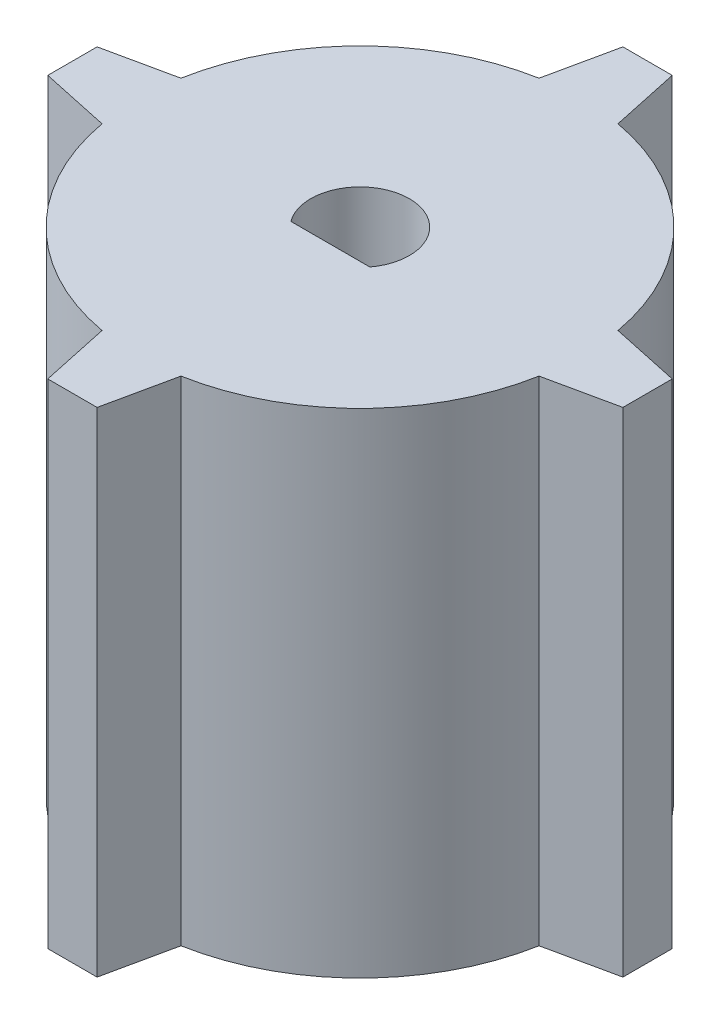
ISO-10303-21;
HEADER;
FILE_DESCRIPTION(('STEP AP214'),'2;1');
FILE_NAME('part.step','',(''),(''),'','','');
FILE_SCHEMA(('AUTOMOTIVE_DESIGN { 1 0 10303 214 1 1 1 1 }'));
ENDSEC;
DATA;
#1=APPLICATION_CONTEXT('core data for automotive mechanical design processes');
#2=APPLICATION_PROTOCOL_DEFINITION('international standard','automotive_design',2000,#1);
#3=PRODUCT_CONTEXT('',#1,'mechanical');
#4=PRODUCT('Part','Part','',(#3));
#5=PRODUCT_RELATED_PRODUCT_CATEGORY('part','',(#4));
#6=PRODUCT_DEFINITION_FORMATION('','',#4);
#7=PRODUCT_DEFINITION_CONTEXT('part definition',#1,'design');
#8=PRODUCT_DEFINITION('design','',#6,#7);
#9=PRODUCT_DEFINITION_SHAPE('','',#8);
#10=(LENGTH_UNIT() NAMED_UNIT(*) SI_UNIT(.MILLI.,.METRE.));
#11=(NAMED_UNIT(*) PLANE_ANGLE_UNIT() SI_UNIT($,.RADIAN.));
#12=(NAMED_UNIT(*) SI_UNIT($,.STERADIAN.) SOLID_ANGLE_UNIT());
#13=UNCERTAINTY_MEASURE_WITH_UNIT(LENGTH_MEASURE(1.E-05),#10,'distance_accuracy_value','');
#14=(GEOMETRIC_REPRESENTATION_CONTEXT(3) GLOBAL_UNCERTAINTY_ASSIGNED_CONTEXT((#13)) GLOBAL_UNIT_ASSIGNED_CONTEXT((#10,
#11,#12)) REPRESENTATION_CONTEXT('',''));
#15=CARTESIAN_POINT('',(0.,0.,0.));
#16=DIRECTION('',(0.,0.,1.));
#17=DIRECTION('',(1.,0.,0.));
#18=AXIS2_PLACEMENT_3D('',#15,#16,#17);
#19=CARTESIAN_POINT('',(0.,25.4,0.));
#20=DIRECTION('',(0.,1.,0.));
#21=DIRECTION('',(0.,0.,1.));
#22=AXIS2_PLACEMENT_3D('',#19,#20,#21);
#23=PLANE('',#22);
#24=CARTESIAN_POINT('',(0.,25.4,0.));
#25=DIRECTION('',(0.,1.,0.));
#26=DIRECTION('',(0.,0.,1.));
#27=AXIS2_PLACEMENT_3D('',#24,#25,#26);
#28=CIRCLE('',#27,11.43);
#29=CARTESIAN_POINT('',(-2.032,25.4,-11.2479276313461));
#30=VERTEX_POINT('',#29);
#31=CARTESIAN_POINT('',(-11.2479276313461,25.4,-2.032));
#32=VERTEX_POINT('',#31);
#33=EDGE_CURVE('E193',#30,#32,#28,.T.);
#34=ORIENTED_EDGE('',*,*,#33,.T.);
#35=DIRECTION('',(-0.977802414077409,0.,0.209529088730874));
#36=VECTOR('',#35,1.);
#37=CARTESIAN_POINT('',(-14.8039276313461,25.4,-1.27));
#38=LINE('',#37,#36);
#39=CARTESIAN_POINT('',(-14.8039276313461,25.4,-1.27));
#40=VERTEX_POINT('',#39);
#41=EDGE_CURVE('E197',#32,#40,#38,.T.);
#42=ORIENTED_EDGE('',*,*,#41,.T.);
#43=DIRECTION('',(0.,0.,1.));
#44=VECTOR('',#43,1.);
#45=CARTESIAN_POINT('',(-14.8039276313461,25.4,1.27));
#46=LINE('',#45,#44);
#47=CARTESIAN_POINT('',(-14.8039276313461,25.4,1.27));
#48=VERTEX_POINT('',#47);
#49=EDGE_CURVE('E201',#40,#48,#46,.T.);
#50=ORIENTED_EDGE('',*,*,#49,.T.);
#51=DIRECTION('',(0.977802414077409,0.,0.209529088730873));
#52=VECTOR('',#51,1.);
#53=CARTESIAN_POINT('',(-11.2479276313461,25.4,2.032));
#54=LINE('',#53,#52);
#55=CARTESIAN_POINT('',(-11.2479276313461,25.4,2.032));
#56=VERTEX_POINT('',#55);
#57=EDGE_CURVE('E204',#48,#56,#54,.T.);
#58=ORIENTED_EDGE('',*,*,#57,.T.);
#59=CARTESIAN_POINT('',(0.,25.4,0.));
#60=DIRECTION('',(0.,1.,0.));
#61=DIRECTION('',(0.,0.,1.));
#62=AXIS2_PLACEMENT_3D('',#59,#60,#61);
#63=CIRCLE('',#62,11.43);
#64=CARTESIAN_POINT('',(-2.032,25.4,11.2479276313461));
#65=VERTEX_POINT('',#64);
#66=EDGE_CURVE('E207',#56,#65,#63,.T.);
#67=ORIENTED_EDGE('',*,*,#66,.T.);
#68=DIRECTION('',(0.209529088730874,0.,0.977802414077409));
#69=VECTOR('',#68,1.);
#70=CARTESIAN_POINT('',(-1.27,25.4,14.8039276313461));
#71=LINE('',#70,#69);
#72=CARTESIAN_POINT('',(-1.27,25.4,14.8039276313461));
#73=VERTEX_POINT('',#72);
#74=EDGE_CURVE('E210',#65,#73,#71,.T.);
#75=ORIENTED_EDGE('',*,*,#74,.T.);
#76=DIRECTION('',(1.,0.,0.));
#77=VECTOR('',#76,1.);
#78=CARTESIAN_POINT('',(1.27,25.4,14.8039276313461));
#79=LINE('',#78,#77);
#80=CARTESIAN_POINT('',(1.27,25.4,14.8039276313461));
#81=VERTEX_POINT('',#80);
#82=EDGE_CURVE('E213',#73,#81,#79,.T.);
#83=ORIENTED_EDGE('',*,*,#82,.T.);
#84=DIRECTION('',(0.209529088730874,0.,-0.977802414077409));
#85=VECTOR('',#84,1.);
#86=CARTESIAN_POINT('',(2.032,25.4,11.2479276313461));
#87=LINE('',#86,#85);
#88=CARTESIAN_POINT('',(2.032,25.4,11.2479276313461));
#89=VERTEX_POINT('',#88);
#90=EDGE_CURVE('E216',#81,#89,#87,.T.);
#91=ORIENTED_EDGE('',*,*,#90,.T.);
#92=CARTESIAN_POINT('',(0.,25.4,0.));
#93=DIRECTION('',(0.,1.,0.));
#94=DIRECTION('',(0.,0.,1.));
#95=AXIS2_PLACEMENT_3D('',#92,#93,#94);
#96=CIRCLE('',#95,11.43);
#97=CARTESIAN_POINT('',(11.2479276313461,25.4,2.032));
#98=VERTEX_POINT('',#97);
#99=EDGE_CURVE('E219',#89,#98,#96,.T.);
#100=ORIENTED_EDGE('',*,*,#99,.T.);
#101=DIRECTION('',(0.977802414077409,0.,-0.209529088730874));
#102=VECTOR('',#101,1.);
#103=CARTESIAN_POINT('',(14.8039276313461,25.4,1.27));
#104=LINE('',#103,#102);
#105=CARTESIAN_POINT('',(14.8039276313461,25.4,1.27));
#106=VERTEX_POINT('',#105);
#107=EDGE_CURVE('E222',#98,#106,#104,.T.);
#108=ORIENTED_EDGE('',*,*,#107,.T.);
#109=DIRECTION('',(0.,0.,-1.));
#110=VECTOR('',#109,1.);
#111=CARTESIAN_POINT('',(14.8039276313461,25.4,-1.27));
#112=LINE('',#111,#110);
#113=CARTESIAN_POINT('',(14.8039276313461,25.4,-1.27));
#114=VERTEX_POINT('',#113);
#115=EDGE_CURVE('E225',#106,#114,#112,.T.);
#116=ORIENTED_EDGE('',*,*,#115,.T.);
#117=DIRECTION('',(-0.977802414077409,0.,-0.209529088730874));
#118=VECTOR('',#117,1.);
#119=CARTESIAN_POINT('',(11.2479276313461,25.4,-2.032));
#120=LINE('',#119,#118);
#121=CARTESIAN_POINT('',(11.2479276313461,25.4,-2.032));
#122=VERTEX_POINT('',#121);
#123=EDGE_CURVE('E228',#114,#122,#120,.T.);
#124=ORIENTED_EDGE('',*,*,#123,.T.);
#125=CARTESIAN_POINT('',(0.,25.4,0.));
#126=DIRECTION('',(0.,1.,0.));
#127=DIRECTION('',(0.,0.,1.));
#128=AXIS2_PLACEMENT_3D('',#125,#126,#127);
#129=CIRCLE('',#128,11.43);
#130=CARTESIAN_POINT('',(2.032,25.4,-11.2479276313461));
#131=VERTEX_POINT('',#130);
#132=EDGE_CURVE('E231',#122,#131,#129,.T.);
#133=ORIENTED_EDGE('',*,*,#132,.T.);
#134=DIRECTION('',(-0.209529088730873,0.,-0.977802414077409));
#135=VECTOR('',#134,1.);
#136=CARTESIAN_POINT('',(1.27,25.4,-14.8039276313461));
#137=LINE('',#136,#135);
#138=CARTESIAN_POINT('',(1.27,25.4,-14.8039276313461));
#139=VERTEX_POINT('',#138);
#140=EDGE_CURVE('E234',#131,#139,#137,.T.);
#141=ORIENTED_EDGE('',*,*,#140,.T.);
#142=DIRECTION('',(-1.,0.,0.));
#143=VECTOR('',#142,1.);
#144=CARTESIAN_POINT('',(-1.27,25.4,-14.8039276313461));
#145=LINE('',#144,#143);
#146=CARTESIAN_POINT('',(-1.27,25.4,-14.8039276313461));
#147=VERTEX_POINT('',#146);
#148=EDGE_CURVE('E237',#139,#147,#145,.T.);
#149=ORIENTED_EDGE('',*,*,#148,.T.);
#150=DIRECTION('',(-0.209529088730874,0.,0.977802414077409));
#151=VECTOR('',#150,1.);
#152=CARTESIAN_POINT('',(-2.032,25.4,-11.2479276313461));
#153=LINE('',#152,#151);
#154=EDGE_CURVE('E240',#147,#30,#153,.T.);
#155=ORIENTED_EDGE('',*,*,#154,.T.);
#156=EDGE_LOOP('',(#34,#42,#50,#58,#67,#75,#83,#91,#100,#108,#116,#124,#133,#141,#149,#155));
#157=FACE_BOUND('',#156,.T.);
#158=DIRECTION('',(1.,0.,0.));
#159=VECTOR('',#158,1.);
#160=CARTESIAN_POINT('',(-2.032,25.4,1.524));
#161=LINE('',#160,#159);
#162=CARTESIAN_POINT('',(-2.032,25.4,1.524));
#163=VERTEX_POINT('',#162);
#164=CARTESIAN_POINT('',(2.032,25.4,1.524));
#165=VERTEX_POINT('',#164);
#166=EDGE_CURVE('E170',#163,#165,#161,.T.);
#167=ORIENTED_EDGE('',*,*,#166,.F.);
#168=CARTESIAN_POINT('',(0.,25.4,0.));
#169=DIRECTION('',(0.,1.,0.));
#170=DIRECTION('',(0.,0.,-1.));
#171=AXIS2_PLACEMENT_3D('',#168,#169,#170);
#172=CIRCLE('',#171,2.54);
#173=EDGE_CURVE('E177',#165,#163,#172,.T.);
#174=ORIENTED_EDGE('',*,*,#173,.F.);
#175=EDGE_LOOP('',(#167,#174));
#176=FACE_BOUND('',#175,.T.);
#177=ADVANCED_FACE('F45',(#157,#176),#23,.T.);
#178=CARTESIAN_POINT('',(0.,0.,0.));
#179=DIRECTION('',(0.,1.,0.));
#180=DIRECTION('',(0.,0.,1.));
#181=AXIS2_PLACEMENT_3D('',#178,#179,#180);
#182=PLANE('',#181);
#183=CARTESIAN_POINT('',(0.,0.,0.));
#184=DIRECTION('',(0.,1.,0.));
#185=DIRECTION('',(0.,0.,1.));
#186=AXIS2_PLACEMENT_3D('',#183,#184,#185);
#187=CIRCLE('',#186,11.43);
#188=CARTESIAN_POINT('',(-2.032,0.,-11.2479276313461));
#189=VERTEX_POINT('',#188);
#190=CARTESIAN_POINT('',(-11.2479276313461,0.,-2.032));
#191=VERTEX_POINT('',#190);
#192=EDGE_CURVE('E192',#189,#191,#187,.T.);
#193=ORIENTED_EDGE('',*,*,#192,.F.);
#194=DIRECTION('',(-0.209529088730874,0.,0.977802414077409));
#195=VECTOR('',#194,1.);
#196=CARTESIAN_POINT('',(-2.032,0.,-11.2479276313461));
#197=LINE('',#196,#195);
#198=CARTESIAN_POINT('',(-1.27,0.,-14.8039276313461));
#199=VERTEX_POINT('',#198);
#200=EDGE_CURVE('E198',#199,#189,#197,.T.);
#201=ORIENTED_EDGE('',*,*,#200,.F.);
#202=DIRECTION('',(-1.,0.,0.));
#203=VECTOR('',#202,1.);
#204=CARTESIAN_POINT('',(-1.27,0.,-14.8039276313461));
#205=LINE('',#204,#203);
#206=CARTESIAN_POINT('',(1.27,0.,-14.8039276313461));
#207=VERTEX_POINT('',#206);
#208=EDGE_CURVE('E286',#207,#199,#205,.T.);
#209=ORIENTED_EDGE('',*,*,#208,.F.);
#210=DIRECTION('',(-0.209529088730873,0.,-0.977802414077409));
#211=VECTOR('',#210,1.);
#212=CARTESIAN_POINT('',(1.27,0.,-14.8039276313461));
#213=LINE('',#212,#211);
#214=CARTESIAN_POINT('',(2.032,0.,-11.2479276313461));
#215=VERTEX_POINT('',#214);
#216=EDGE_CURVE('E283',#215,#207,#213,.T.);
#217=ORIENTED_EDGE('',*,*,#216,.F.);
#218=CARTESIAN_POINT('',(0.,0.,0.));
#219=DIRECTION('',(0.,1.,0.));
#220=DIRECTION('',(0.,0.,1.));
#221=AXIS2_PLACEMENT_3D('',#218,#219,#220);
#222=CIRCLE('',#221,11.43);
#223=CARTESIAN_POINT('',(11.2479276313461,0.,-2.032));
#224=VERTEX_POINT('',#223);
#225=EDGE_CURVE('E280',#224,#215,#222,.T.);
#226=ORIENTED_EDGE('',*,*,#225,.F.);
#227=DIRECTION('',(-0.977802414077409,0.,-0.209529088730874));
#228=VECTOR('',#227,1.);
#229=CARTESIAN_POINT('',(11.2479276313461,0.,-2.032));
#230=LINE('',#229,#228);
#231=CARTESIAN_POINT('',(14.8039276313461,0.,-1.27));
#232=VERTEX_POINT('',#231);
#233=EDGE_CURVE('E277',#232,#224,#230,.T.);
#234=ORIENTED_EDGE('',*,*,#233,.F.);
#235=DIRECTION('',(0.,0.,-1.));
#236=VECTOR('',#235,1.);
#237=CARTESIAN_POINT('',(14.8039276313461,0.,-1.27));
#238=LINE('',#237,#236);
#239=CARTESIAN_POINT('',(14.8039276313461,0.,1.27));
#240=VERTEX_POINT('',#239);
#241=EDGE_CURVE('E274',#240,#232,#238,.T.);
#242=ORIENTED_EDGE('',*,*,#241,.F.);
#243=DIRECTION('',(0.977802414077409,0.,-0.209529088730874));
#244=VECTOR('',#243,1.);
#245=CARTESIAN_POINT('',(14.8039276313461,0.,1.27));
#246=LINE('',#245,#244);
#247=CARTESIAN_POINT('',(11.2479276313461,0.,2.032));
#248=VERTEX_POINT('',#247);
#249=EDGE_CURVE('E271',#248,#240,#246,.T.);
#250=ORIENTED_EDGE('',*,*,#249,.F.);
#251=CARTESIAN_POINT('',(0.,0.,0.));
#252=DIRECTION('',(0.,1.,0.));
#253=DIRECTION('',(0.,0.,1.));
#254=AXIS2_PLACEMENT_3D('',#251,#252,#253);
#255=CIRCLE('',#254,11.43);
#256=CARTESIAN_POINT('',(2.032,0.,11.2479276313461));
#257=VERTEX_POINT('',#256);
#258=EDGE_CURVE('E268',#257,#248,#255,.T.);
#259=ORIENTED_EDGE('',*,*,#258,.F.);
#260=DIRECTION('',(0.209529088730874,0.,-0.977802414077409));
#261=VECTOR('',#260,1.);
#262=CARTESIAN_POINT('',(2.032,0.,11.2479276313461));
#263=LINE('',#262,#261);
#264=CARTESIAN_POINT('',(1.27,0.,14.8039276313461));
#265=VERTEX_POINT('',#264);
#266=EDGE_CURVE('E265',#265,#257,#263,.T.);
#267=ORIENTED_EDGE('',*,*,#266,.F.);
#268=DIRECTION('',(1.,0.,0.));
#269=VECTOR('',#268,1.);
#270=CARTESIAN_POINT('',(1.27,0.,14.8039276313461));
#271=LINE('',#270,#269);
#272=CARTESIAN_POINT('',(-1.27,0.,14.8039276313461));
#273=VERTEX_POINT('',#272);
#274=EDGE_CURVE('E262',#273,#265,#271,.T.);
#275=ORIENTED_EDGE('',*,*,#274,.F.);
#276=DIRECTION('',(0.209529088730874,0.,0.977802414077409));
#277=VECTOR('',#276,1.);
#278=CARTESIAN_POINT('',(-1.27,0.,14.8039276313461));
#279=LINE('',#278,#277);
#280=CARTESIAN_POINT('',(-2.032,0.,11.2479276313461));
#281=VERTEX_POINT('',#280);
#282=EDGE_CURVE('E259',#281,#273,#279,.T.);
#283=ORIENTED_EDGE('',*,*,#282,.F.);
#284=CARTESIAN_POINT('',(0.,0.,0.));
#285=DIRECTION('',(0.,1.,0.));
#286=DIRECTION('',(0.,0.,1.));
#287=AXIS2_PLACEMENT_3D('',#284,#285,#286);
#288=CIRCLE('',#287,11.43);
#289=CARTESIAN_POINT('',(-11.2479276313461,0.,2.032));
#290=VERTEX_POINT('',#289);
#291=EDGE_CURVE('E256',#290,#281,#288,.T.);
#292=ORIENTED_EDGE('',*,*,#291,.F.);
#293=DIRECTION('',(0.977802414077409,0.,0.209529088730873));
#294=VECTOR('',#293,1.);
#295=CARTESIAN_POINT('',(-11.2479276313461,0.,2.032));
#296=LINE('',#295,#294);
#297=CARTESIAN_POINT('',(-14.8039276313461,0.,1.27));
#298=VERTEX_POINT('',#297);
#299=EDGE_CURVE('E253',#298,#290,#296,.T.);
#300=ORIENTED_EDGE('',*,*,#299,.F.);
#301=DIRECTION('',(0.,0.,1.));
#302=VECTOR('',#301,1.);
#303=CARTESIAN_POINT('',(-14.8039276313461,0.,1.27));
#304=LINE('',#303,#302);
#305=CARTESIAN_POINT('',(-14.8039276313461,0.,-1.27));
#306=VERTEX_POINT('',#305);
#307=EDGE_CURVE('E250',#306,#298,#304,.T.);
#308=ORIENTED_EDGE('',*,*,#307,.F.);
#309=DIRECTION('',(-0.977802414077409,0.,0.209529088730874));
#310=VECTOR('',#309,1.);
#311=CARTESIAN_POINT('',(-14.8039276313461,0.,-1.27));
#312=LINE('',#311,#310);
#313=EDGE_CURVE('E247',#191,#306,#312,.T.);
#314=ORIENTED_EDGE('',*,*,#313,.F.);
#315=EDGE_LOOP('',(#193,#201,#209,#217,#226,#234,#242,#250,#259,#267,#275,#283,#292,#300,#308,#314));
#316=FACE_BOUND('',#315,.T.);
#317=CARTESIAN_POINT('',(0.,0.,0.));
#318=DIRECTION('',(0.,1.,0.));
#319=DIRECTION('',(0.,0.,-1.));
#320=AXIS2_PLACEMENT_3D('',#317,#318,#319);
#321=CIRCLE('',#320,2.54);
#322=CARTESIAN_POINT('',(2.032,0.,1.524));
#323=VERTEX_POINT('',#322);
#324=CARTESIAN_POINT('',(-2.032,0.,1.524));
#325=VERTEX_POINT('',#324);
#326=EDGE_CURVE('E68',#323,#325,#321,.T.);
#327=ORIENTED_EDGE('',*,*,#326,.T.);
#328=DIRECTION('',(1.,0.,0.));
#329=VECTOR('',#328,1.);
#330=CARTESIAN_POINT('',(-2.032,0.,1.524));
#331=LINE('',#330,#329);
#332=EDGE_CURVE('E183',#325,#323,#331,.T.);
#333=ORIENTED_EDGE('',*,*,#332,.T.);
#334=EDGE_LOOP('',(#327,#333));
#335=FACE_BOUND('',#334,.T.);
#336=ADVANCED_FACE('F357',(#316,#335),#182,.F.);
#337=CARTESIAN_POINT('',(0.,25.4,0.));
#338=DIRECTION('',(0.,-1.,0.));
#339=DIRECTION('',(0.,0.,-1.));
#340=AXIS2_PLACEMENT_3D('',#337,#338,#339);
#341=CYLINDRICAL_SURFACE('',#340,11.43);
#342=ORIENTED_EDGE('',*,*,#192,.T.);
#343=DIRECTION('',(0.,-1.,0.));
#344=VECTOR('',#343,1.);
#345=CARTESIAN_POINT('',(-11.2479276313461,25.4,-2.032));
#346=LINE('',#345,#344);
#347=EDGE_CURVE('E11',#32,#191,#346,.T.);
#348=ORIENTED_EDGE('',*,*,#347,.F.);
#349=ORIENTED_EDGE('',*,*,#33,.F.);
#350=DIRECTION('',(0.,-1.,0.));
#351=VECTOR('',#350,1.);
#352=CARTESIAN_POINT('',(-2.032,25.4,-11.2479276313461));
#353=LINE('',#352,#351);
#354=EDGE_CURVE('E243',#30,#189,#353,.T.);
#355=ORIENTED_EDGE('',*,*,#354,.T.);
#356=EDGE_LOOP('',(#342,#348,#349,#355));
#357=FACE_BOUND('',#356,.T.);
#358=ADVANCED_FACE('F47',(#357),#341,.T.);
#359=CARTESIAN_POINT('',(-14.8039276313461,25.4,-1.27));
#360=DIRECTION('',(0.209529088730874,0.,0.977802414077409));
#361=DIRECTION('',(0.977802414077409,0.,-0.209529088730874));
#362=AXIS2_PLACEMENT_3D('',#359,#360,#361);
#363=PLANE('',#362);
#364=ORIENTED_EDGE('',*,*,#313,.T.);
#365=DIRECTION('',(0.,-1.,0.));
#366=VECTOR('',#365,1.);
#367=CARTESIAN_POINT('',(-14.8039276313461,25.4,-1.27));
#368=LINE('',#367,#366);
#369=EDGE_CURVE('E54',#40,#306,#368,.T.);
#370=ORIENTED_EDGE('',*,*,#369,.F.);
#371=ORIENTED_EDGE('',*,*,#41,.F.);
#372=ORIENTED_EDGE('',*,*,#347,.T.);
#373=EDGE_LOOP('',(#364,#370,#371,#372));
#374=FACE_BOUND('',#373,.T.);
#375=ADVANCED_FACE('F374',(#374),#363,.F.);
#376=CARTESIAN_POINT('',(-14.8039276313461,25.4,1.27));
#377=DIRECTION('',(1.,0.,0.));
#378=DIRECTION('',(0.,0.,-1.));
#379=AXIS2_PLACEMENT_3D('',#376,#377,#378);
#380=PLANE('',#379);
#381=ORIENTED_EDGE('',*,*,#307,.T.);
#382=DIRECTION('',(0.,-1.,0.));
#383=VECTOR('',#382,1.);
#384=CARTESIAN_POINT('',(-14.8039276313461,25.4,1.27));
#385=LINE('',#384,#383);
#386=EDGE_CURVE('E342',#48,#298,#385,.T.);
#387=ORIENTED_EDGE('',*,*,#386,.F.);
#388=ORIENTED_EDGE('',*,*,#49,.F.);
#389=ORIENTED_EDGE('',*,*,#369,.T.);
#390=EDGE_LOOP('',(#381,#387,#388,#389));
#391=FACE_BOUND('',#390,.T.);
#392=ADVANCED_FACE('F351',(#391),#380,.F.);
#393=CARTESIAN_POINT('',(-11.2479276313461,25.4,2.032));
#394=DIRECTION('',(0.209529088730873,0.,-0.977802414077409));
#395=DIRECTION('',(-0.97780241407741,0.,-0.209529088730874));
#396=AXIS2_PLACEMENT_3D('',#393,#394,#395);
#397=PLANE('',#396);
#398=ORIENTED_EDGE('',*,*,#299,.T.);
#399=DIRECTION('',(0.,-1.,0.));
#400=VECTOR('',#399,1.);
#401=CARTESIAN_POINT('',(-11.2479276313461,25.4,2.032));
#402=LINE('',#401,#400);
#403=EDGE_CURVE('E338',#56,#290,#402,.T.);
#404=ORIENTED_EDGE('',*,*,#403,.F.);
#405=ORIENTED_EDGE('',*,*,#57,.F.);
#406=ORIENTED_EDGE('',*,*,#386,.T.);
#407=EDGE_LOOP('',(#398,#404,#405,#406));
#408=FACE_BOUND('',#407,.T.);
#409=ADVANCED_FACE('F363',(#408),#397,.F.);
#410=CARTESIAN_POINT('',(0.,25.4,0.));
#411=DIRECTION('',(0.,-1.,0.));
#412=DIRECTION('',(0.,0.,-1.));
#413=AXIS2_PLACEMENT_3D('',#410,#411,#412);
#414=CYLINDRICAL_SURFACE('',#413,11.43);
#415=ORIENTED_EDGE('',*,*,#291,.T.);
#416=DIRECTION('',(0.,-1.,0.));
#417=VECTOR('',#416,1.);
#418=CARTESIAN_POINT('',(-2.032,25.4,11.2479276313461));
#419=LINE('',#418,#417);
#420=EDGE_CURVE('E334',#65,#281,#419,.T.);
#421=ORIENTED_EDGE('',*,*,#420,.F.);
#422=ORIENTED_EDGE('',*,*,#66,.F.);
#423=ORIENTED_EDGE('',*,*,#403,.T.);
#424=EDGE_LOOP('',(#415,#421,#422,#423));
#425=FACE_BOUND('',#424,.T.);
#426=ADVANCED_FACE('F367',(#425),#414,.T.);
#427=CARTESIAN_POINT('',(-1.27,25.4,14.8039276313461));
#428=DIRECTION('',(0.977802414077409,0.,-0.209529088730874));
#429=DIRECTION('',(-0.209529088730874,0.,-0.97780241407741));
#430=AXIS2_PLACEMENT_3D('',#427,#428,#429);
#431=PLANE('',#430);
#432=ORIENTED_EDGE('',*,*,#282,.T.);
#433=DIRECTION('',(0.,-1.,0.));
#434=VECTOR('',#433,1.);
#435=CARTESIAN_POINT('',(-1.27,25.4,14.8039276313461));
#436=LINE('',#435,#434);
#437=EDGE_CURVE('E330',#73,#273,#436,.T.);
#438=ORIENTED_EDGE('',*,*,#437,.F.);
#439=ORIENTED_EDGE('',*,*,#74,.F.);
#440=ORIENTED_EDGE('',*,*,#420,.T.);
#441=EDGE_LOOP('',(#432,#438,#439,#440));
#442=FACE_BOUND('',#441,.T.);
#443=ADVANCED_FACE('F427',(#442),#431,.F.);
#444=CARTESIAN_POINT('',(1.27,25.4,14.8039276313461));
#445=DIRECTION('',(0.,0.,-1.));
#446=DIRECTION('',(-1.,0.,0.));
#447=AXIS2_PLACEMENT_3D('',#444,#445,#446);
#448=PLANE('',#447);
#449=ORIENTED_EDGE('',*,*,#274,.T.);
#450=DIRECTION('',(0.,-1.,0.));
#451=VECTOR('',#450,1.);
#452=CARTESIAN_POINT('',(1.27,25.4,14.8039276313461));
#453=LINE('',#452,#451);
#454=EDGE_CURVE('E326',#81,#265,#453,.T.);
#455=ORIENTED_EDGE('',*,*,#454,.F.);
#456=ORIENTED_EDGE('',*,*,#82,.F.);
#457=ORIENTED_EDGE('',*,*,#437,.T.);
#458=EDGE_LOOP('',(#449,#455,#456,#457));
#459=FACE_BOUND('',#458,.T.);
#460=ADVANCED_FACE('F424',(#459),#448,.F.);
#461=CARTESIAN_POINT('',(2.032,25.4,11.2479276313461));
#462=DIRECTION('',(-0.977802414077409,0.,-0.209529088730874));
#463=DIRECTION('',(-0.209529088730874,0.,0.97780241407741));
#464=AXIS2_PLACEMENT_3D('',#461,#462,#463);
#465=PLANE('',#464);
#466=ORIENTED_EDGE('',*,*,#266,.T.);
#467=DIRECTION('',(0.,-1.,0.));
#468=VECTOR('',#467,1.);
#469=CARTESIAN_POINT('',(2.032,25.4,11.2479276313461));
#470=LINE('',#469,#468);
#471=EDGE_CURVE('E322',#89,#257,#470,.T.);
#472=ORIENTED_EDGE('',*,*,#471,.F.);
#473=ORIENTED_EDGE('',*,*,#90,.F.);
#474=ORIENTED_EDGE('',*,*,#454,.T.);
#475=EDGE_LOOP('',(#466,#472,#473,#474));
#476=FACE_BOUND('',#475,.T.);
#477=ADVANCED_FACE('F420',(#476),#465,.F.);
#478=CARTESIAN_POINT('',(0.,25.4,0.));
#479=DIRECTION('',(0.,-1.,0.));
#480=DIRECTION('',(0.,0.,-1.));
#481=AXIS2_PLACEMENT_3D('',#478,#479,#480);
#482=CYLINDRICAL_SURFACE('',#481,11.43);
#483=ORIENTED_EDGE('',*,*,#258,.T.);
#484=DIRECTION('',(0.,-1.,0.));
#485=VECTOR('',#484,1.);
#486=CARTESIAN_POINT('',(11.2479276313461,25.4,2.032));
#487=LINE('',#486,#485);
#488=EDGE_CURVE('E318',#98,#248,#487,.T.);
#489=ORIENTED_EDGE('',*,*,#488,.F.);
#490=ORIENTED_EDGE('',*,*,#99,.F.);
#491=ORIENTED_EDGE('',*,*,#471,.T.);
#492=EDGE_LOOP('',(#483,#489,#490,#491));
#493=FACE_BOUND('',#492,.T.);
#494=ADVANCED_FACE('F416',(#493),#482,.T.);
#495=CARTESIAN_POINT('',(14.8039276313461,25.4,1.27));
#496=DIRECTION('',(-0.209529088730874,0.,-0.977802414077409));
#497=DIRECTION('',(-0.97780241407741,0.,0.209529088730874));
#498=AXIS2_PLACEMENT_3D('',#495,#496,#497);
#499=PLANE('',#498);
#500=ORIENTED_EDGE('',*,*,#249,.T.);
#501=DIRECTION('',(0.,-1.,0.));
#502=VECTOR('',#501,1.);
#503=CARTESIAN_POINT('',(14.8039276313461,25.4,1.27));
#504=LINE('',#503,#502);
#505=EDGE_CURVE('E314',#106,#240,#504,.T.);
#506=ORIENTED_EDGE('',*,*,#505,.F.);
#507=ORIENTED_EDGE('',*,*,#107,.F.);
#508=ORIENTED_EDGE('',*,*,#488,.T.);
#509=EDGE_LOOP('',(#500,#506,#507,#508));
#510=FACE_BOUND('',#509,.T.);
#511=ADVANCED_FACE('F411',(#510),#499,.F.);
#512=CARTESIAN_POINT('',(14.8039276313461,25.4,-1.27));
#513=DIRECTION('',(-1.,0.,0.));
#514=DIRECTION('',(0.,0.,1.));
#515=AXIS2_PLACEMENT_3D('',#512,#513,#514);
#516=PLANE('',#515);
#517=ORIENTED_EDGE('',*,*,#241,.T.);
#518=DIRECTION('',(0.,-1.,0.));
#519=VECTOR('',#518,1.);
#520=CARTESIAN_POINT('',(14.8039276313461,25.4,-1.27));
#521=LINE('',#520,#519);
#522=EDGE_CURVE('E310',#114,#232,#521,.T.);
#523=ORIENTED_EDGE('',*,*,#522,.F.);
#524=ORIENTED_EDGE('',*,*,#115,.F.);
#525=ORIENTED_EDGE('',*,*,#505,.T.);
#526=EDGE_LOOP('',(#517,#523,#524,#525));
#527=FACE_BOUND('',#526,.T.);
#528=ADVANCED_FACE('F405',(#527),#516,.F.);
#529=CARTESIAN_POINT('',(11.2479276313461,25.4,-2.032));
#530=DIRECTION('',(-0.209529088730874,0.,0.977802414077409));
#531=DIRECTION('',(0.97780241407741,0.,0.209529088730874));
#532=AXIS2_PLACEMENT_3D('',#529,#530,#531);
#533=PLANE('',#532);
#534=ORIENTED_EDGE('',*,*,#233,.T.);
#535=DIRECTION('',(0.,-1.,0.));
#536=VECTOR('',#535,1.);
#537=CARTESIAN_POINT('',(11.2479276313461,25.4,-2.032));
#538=LINE('',#537,#536);
#539=EDGE_CURVE('E306',#122,#224,#538,.T.);
#540=ORIENTED_EDGE('',*,*,#539,.F.);
#541=ORIENTED_EDGE('',*,*,#123,.F.);
#542=ORIENTED_EDGE('',*,*,#522,.T.);
#543=EDGE_LOOP('',(#534,#540,#541,#542));
#544=FACE_BOUND('',#543,.T.);
#545=ADVANCED_FACE('F401',(#544),#533,.F.);
#546=CARTESIAN_POINT('',(0.,25.4,0.));
#547=DIRECTION('',(0.,-1.,0.));
#548=DIRECTION('',(0.,0.,-1.));
#549=AXIS2_PLACEMENT_3D('',#546,#547,#548);
#550=CYLINDRICAL_SURFACE('',#549,11.43);
#551=ORIENTED_EDGE('',*,*,#225,.T.);
#552=DIRECTION('',(0.,-1.,0.));
#553=VECTOR('',#552,1.);
#554=CARTESIAN_POINT('',(2.032,25.4,-11.2479276313461));
#555=LINE('',#554,#553);
#556=EDGE_CURVE('E302',#131,#215,#555,.T.);
#557=ORIENTED_EDGE('',*,*,#556,.F.);
#558=ORIENTED_EDGE('',*,*,#132,.F.);
#559=ORIENTED_EDGE('',*,*,#539,.T.);
#560=EDGE_LOOP('',(#551,#557,#558,#559));
#561=FACE_BOUND('',#560,.T.);
#562=ADVANCED_FACE('F396',(#561),#550,.T.);
#563=CARTESIAN_POINT('',(1.27,25.4,-14.8039276313461));
#564=DIRECTION('',(-0.977802414077409,0.,0.209529088730873));
#565=DIRECTION('',(0.209529088730873,0.,0.97780241407741));
#566=AXIS2_PLACEMENT_3D('',#563,#564,#565);
#567=PLANE('',#566);
#568=ORIENTED_EDGE('',*,*,#216,.T.);
#569=DIRECTION('',(0.,-1.,0.));
#570=VECTOR('',#569,1.);
#571=CARTESIAN_POINT('',(1.27,25.4,-14.8039276313461));
#572=LINE('',#571,#570);
#573=EDGE_CURVE('E298',#139,#207,#572,.T.);
#574=ORIENTED_EDGE('',*,*,#573,.F.);
#575=ORIENTED_EDGE('',*,*,#140,.F.);
#576=ORIENTED_EDGE('',*,*,#556,.T.);
#577=EDGE_LOOP('',(#568,#574,#575,#576));
#578=FACE_BOUND('',#577,.T.);
#579=ADVANCED_FACE('F390',(#578),#567,.F.);
#580=CARTESIAN_POINT('',(-1.27,25.4,-14.8039276313461));
#581=DIRECTION('',(0.,0.,1.));
#582=DIRECTION('',(1.,0.,0.));
#583=AXIS2_PLACEMENT_3D('',#580,#581,#582);
#584=PLANE('',#583);
#585=ORIENTED_EDGE('',*,*,#208,.T.);
#586=DIRECTION('',(0.,-1.,0.));
#587=VECTOR('',#586,1.);
#588=CARTESIAN_POINT('',(-1.27,25.4,-14.8039276313461));
#589=LINE('',#588,#587);
#590=EDGE_CURVE('E294',#147,#199,#589,.T.);
#591=ORIENTED_EDGE('',*,*,#590,.F.);
#592=ORIENTED_EDGE('',*,*,#148,.F.);
#593=ORIENTED_EDGE('',*,*,#573,.T.);
#594=EDGE_LOOP('',(#585,#591,#592,#593));
#595=FACE_BOUND('',#594,.T.);
#596=ADVANCED_FACE('F386',(#595),#584,.F.);
#597=CARTESIAN_POINT('',(-2.032,25.4,-11.2479276313461));
#598=DIRECTION('',(0.977802414077409,0.,0.209529088730874));
#599=DIRECTION('',(0.209529088730874,0.,-0.97780241407741));
#600=AXIS2_PLACEMENT_3D('',#597,#598,#599);
#601=PLANE('',#600);
#602=ORIENTED_EDGE('',*,*,#200,.T.);
#603=ORIENTED_EDGE('',*,*,#354,.F.);
#604=ORIENTED_EDGE('',*,*,#154,.F.);
#605=ORIENTED_EDGE('',*,*,#590,.T.);
#606=EDGE_LOOP('',(#602,#603,#604,#605));
#607=FACE_BOUND('',#606,.T.);
#608=ADVANCED_FACE('F381',(#607),#601,.F.);
#609=CARTESIAN_POINT('',(0.,25.4,0.));
#610=DIRECTION('',(0.,-1.,0.));
#611=DIRECTION('',(0.,0.,-1.));
#612=AXIS2_PLACEMENT_3D('',#609,#610,#611);
#613=CYLINDRICAL_SURFACE('',#612,2.54);
#614=ORIENTED_EDGE('',*,*,#326,.F.);
#615=DIRECTION('',(0.,-1.,0.));
#616=VECTOR('',#615,1.);
#617=CARTESIAN_POINT('',(2.032,25.4,1.524));
#618=LINE('',#617,#616);
#619=EDGE_CURVE('E172',#165,#323,#618,.T.);
#620=ORIENTED_EDGE('',*,*,#619,.F.);
#621=ORIENTED_EDGE('',*,*,#173,.T.);
#622=DIRECTION('',(0.,-1.,0.));
#623=VECTOR('',#622,1.);
#624=CARTESIAN_POINT('',(-2.032,25.4,1.524));
#625=LINE('',#624,#623);
#626=EDGE_CURVE('E61',#163,#325,#625,.T.);
#627=ORIENTED_EDGE('',*,*,#626,.T.);
#628=EDGE_LOOP('',(#614,#620,#621,#627));
#629=FACE_BOUND('',#628,.T.);
#630=ADVANCED_FACE('F179',(#629),#613,.F.);
#631=CARTESIAN_POINT('',(-2.032,25.4,1.524));
#632=DIRECTION('',(0.,0.,-1.));
#633=DIRECTION('',(-1.,0.,0.));
#634=AXIS2_PLACEMENT_3D('',#631,#632,#633);
#635=PLANE('',#634);
#636=ORIENTED_EDGE('',*,*,#332,.F.);
#637=ORIENTED_EDGE('',*,*,#626,.F.);
#638=ORIENTED_EDGE('',*,*,#166,.T.);
#639=ORIENTED_EDGE('',*,*,#619,.T.);
#640=EDGE_LOOP('',(#636,#637,#638,#639));
#641=FACE_BOUND('',#640,.T.);
#642=ADVANCED_FACE('F171',(#641),#635,.T.);
#643=CLOSED_SHELL('',(#177,#336,#358,#375,#392,#409,#426,#443,#460,#477,#494,#511,#528,#545,
#562,#579,#596,#608,#630,#642));
#644=MANIFOLD_SOLID_BREP('B2',#643);
#645=ADVANCED_BREP_SHAPE_REPRESENTATION('',(#18,#644),#14);
#646=SHAPE_DEFINITION_REPRESENTATION(#9,#645);
ENDSEC;
END-ISO-10303-21;
